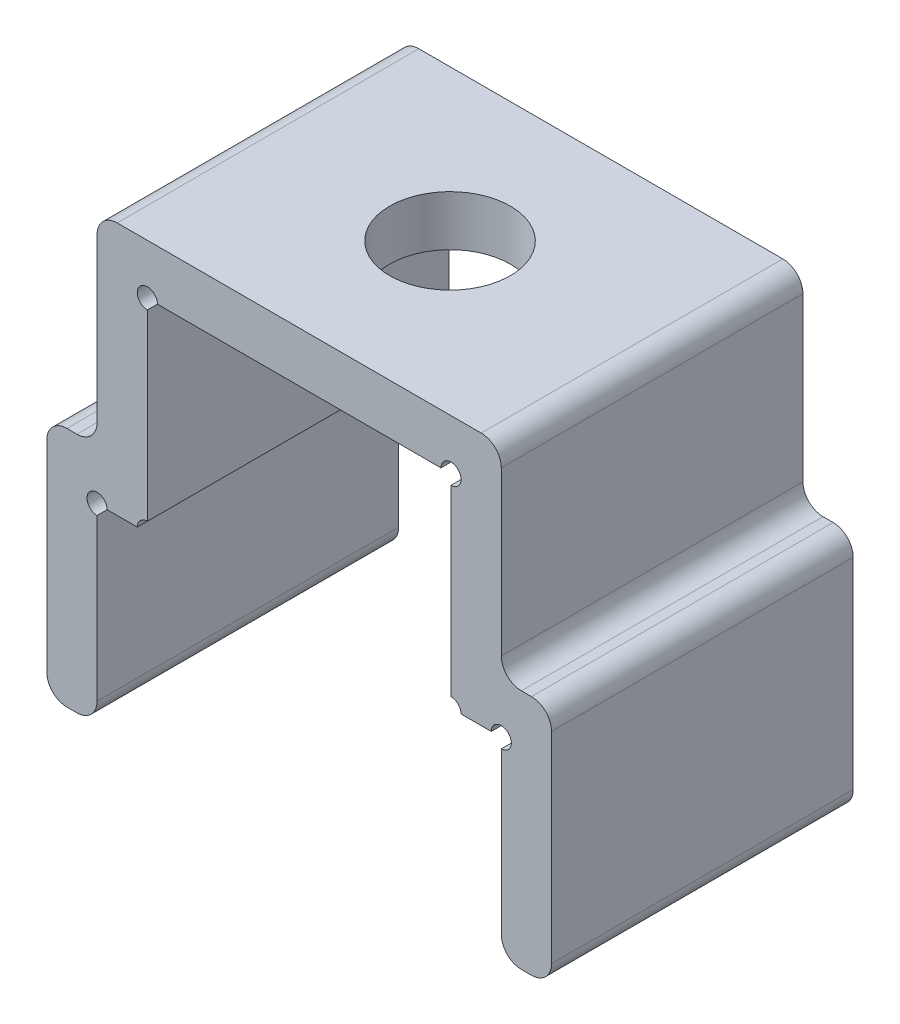
ISO-10303-21;
HEADER;
FILE_DESCRIPTION(('STEP AP214'),'2;1');
FILE_NAME('part.step','',(''),(''),'','','');
FILE_SCHEMA(('AUTOMOTIVE_DESIGN { 1 0 10303 214 1 1 1 1 }'));
ENDSEC;
DATA;
#1=APPLICATION_CONTEXT('core data for automotive mechanical design processes');
#2=APPLICATION_PROTOCOL_DEFINITION('international standard','automotive_design',2000,#1);
#3=PRODUCT_CONTEXT('',#1,'mechanical');
#4=PRODUCT('Part','Part','',(#3));
#5=PRODUCT_RELATED_PRODUCT_CATEGORY('part','',(#4));
#6=PRODUCT_DEFINITION_FORMATION('','',#4);
#7=PRODUCT_DEFINITION_CONTEXT('part definition',#1,'design');
#8=PRODUCT_DEFINITION('design','',#6,#7);
#9=PRODUCT_DEFINITION_SHAPE('','',#8);
#10=(LENGTH_UNIT() NAMED_UNIT(*) SI_UNIT(.MILLI.,.METRE.));
#11=(NAMED_UNIT(*) PLANE_ANGLE_UNIT() SI_UNIT($,.RADIAN.));
#12=(NAMED_UNIT(*) SI_UNIT($,.STERADIAN.) SOLID_ANGLE_UNIT());
#13=UNCERTAINTY_MEASURE_WITH_UNIT(LENGTH_MEASURE(1.E-05),#10,'distance_accuracy_value','');
#14=(GEOMETRIC_REPRESENTATION_CONTEXT(3) GLOBAL_UNCERTAINTY_ASSIGNED_CONTEXT((#13)) GLOBAL_UNIT_ASSIGNED_CONTEXT((#10,
#11,#12)) REPRESENTATION_CONTEXT('',''));
#15=CARTESIAN_POINT('',(0.,0.,0.));
#16=DIRECTION('',(0.,0.,1.));
#17=DIRECTION('',(1.,0.,0.));
#18=AXIS2_PLACEMENT_3D('',#15,#16,#17);
#19=CARTESIAN_POINT('',(7.55,5.05,15.));
#20=DIRECTION('',(0.,0.,-1.));
#21=DIRECTION('',(-1.,0.,0.));
#22=AXIS2_PLACEMENT_3D('',#19,#20,#21);
#23=CYLINDRICAL_SURFACE('',#22,0.5);
#24=CARTESIAN_POINT('',(7.55,5.05,0.));
#25=DIRECTION('',(0.,0.,-1.));
#26=DIRECTION('',(1.,0.,0.));
#27=AXIS2_PLACEMENT_3D('',#24,#25,#26);
#28=CIRCLE('',#27,0.5);
#29=CARTESIAN_POINT('',(7.05,5.05,0.));
#30=VERTEX_POINT('',#29);
#31=CARTESIAN_POINT('',(7.55,4.55,0.));
#32=VERTEX_POINT('',#31);
#33=EDGE_CURVE('E285',#30,#32,#28,.T.);
#34=ORIENTED_EDGE('',*,*,#33,.T.);
#35=DIRECTION('',(0.,0.,-1.));
#36=VECTOR('',#35,1.);
#37=CARTESIAN_POINT('',(7.55,4.55,15.));
#38=LINE('',#37,#36);
#39=CARTESIAN_POINT('',(7.55,4.55,15.));
#40=VERTEX_POINT('',#39);
#41=EDGE_CURVE('E11',#40,#32,#38,.T.);
#42=ORIENTED_EDGE('',*,*,#41,.F.);
#43=CARTESIAN_POINT('',(7.55,5.05,15.));
#44=DIRECTION('',(0.,0.,-1.));
#45=DIRECTION('',(1.,0.,0.));
#46=AXIS2_PLACEMENT_3D('',#43,#44,#45);
#47=CIRCLE('',#46,0.5);
#48=CARTESIAN_POINT('',(7.05,5.05,15.));
#49=VERTEX_POINT('',#48);
#50=EDGE_CURVE('E379',#49,#40,#47,.T.);
#51=ORIENTED_EDGE('',*,*,#50,.F.);
#52=DIRECTION('',(0.,0.,-1.));
#53=VECTOR('',#52,1.);
#54=CARTESIAN_POINT('',(7.05,5.05,15.));
#55=LINE('',#54,#53);
#56=EDGE_CURVE('E281',#49,#30,#55,.T.);
#57=ORIENTED_EDGE('',*,*,#56,.T.);
#58=EDGE_LOOP('',(#34,#42,#51,#57));
#59=FACE_BOUND('',#58,.T.);
#60=ADVANCED_FACE('F39',(#59),#23,.F.);
#61=CARTESIAN_POINT('',(7.55,4.55,15.));
#62=DIRECTION('',(1.,0.,0.));
#63=DIRECTION('',(0.,1.,0.));
#64=AXIS2_PLACEMENT_3D('',#61,#62,#63);
#65=PLANE('',#64);
#66=DIRECTION('',(0.,-1.,0.));
#67=VECTOR('',#66,1.);
#68=CARTESIAN_POINT('',(7.55,4.55,0.));
#69=LINE('',#68,#67);
#70=CARTESIAN_POINT('',(7.55,-4.55,0.));
#71=VERTEX_POINT('',#70);
#72=EDGE_CURVE('E289',#32,#71,#69,.T.);
#73=ORIENTED_EDGE('',*,*,#72,.T.);
#74=DIRECTION('',(0.,0.,-1.));
#75=VECTOR('',#74,1.);
#76=CARTESIAN_POINT('',(7.55,-4.55,15.));
#77=LINE('',#76,#75);
#78=CARTESIAN_POINT('',(7.55,-4.55,15.));
#79=VERTEX_POINT('',#78);
#80=EDGE_CURVE('E49',#79,#71,#77,.T.);
#81=ORIENTED_EDGE('',*,*,#80,.F.);
#82=DIRECTION('',(0.,-1.,0.));
#83=VECTOR('',#82,1.);
#84=CARTESIAN_POINT('',(7.55,4.55,15.));
#85=LINE('',#84,#83);
#86=EDGE_CURVE('E172',#40,#79,#85,.T.);
#87=ORIENTED_EDGE('',*,*,#86,.F.);
#88=ORIENTED_EDGE('',*,*,#41,.T.);
#89=EDGE_LOOP('',(#73,#81,#87,#88));
#90=FACE_BOUND('',#89,.T.);
#91=ADVANCED_FACE('F616',(#90),#65,.F.);
#92=CARTESIAN_POINT('',(7.55,-5.05,15.));
#93=DIRECTION('',(0.,0.,-1.));
#94=DIRECTION('',(-1.,0.,0.));
#95=AXIS2_PLACEMENT_3D('',#92,#93,#94);
#96=CYLINDRICAL_SURFACE('',#95,0.5);
#97=CARTESIAN_POINT('',(7.55,-5.05,0.));
#98=DIRECTION('',(0.,0.,-1.));
#99=DIRECTION('',(1.,0.,0.));
#100=AXIS2_PLACEMENT_3D('',#97,#98,#99);
#101=CIRCLE('',#100,0.5);
#102=CARTESIAN_POINT('',(8.05,-5.05,0.));
#103=VERTEX_POINT('',#102);
#104=EDGE_CURVE('E292',#71,#103,#101,.T.);
#105=ORIENTED_EDGE('',*,*,#104,.T.);
#106=DIRECTION('',(0.,0.,-1.));
#107=VECTOR('',#106,1.);
#108=CARTESIAN_POINT('',(8.05,-5.05,15.));
#109=LINE('',#108,#107);
#110=CARTESIAN_POINT('',(8.05,-5.05,15.));
#111=VERTEX_POINT('',#110);
#112=EDGE_CURVE('E486',#111,#103,#109,.T.);
#113=ORIENTED_EDGE('',*,*,#112,.F.);
#114=CARTESIAN_POINT('',(7.55,-5.05,15.));
#115=DIRECTION('',(0.,0.,-1.));
#116=DIRECTION('',(1.,0.,0.));
#117=AXIS2_PLACEMENT_3D('',#114,#115,#116);
#118=CIRCLE('',#117,0.5);
#119=EDGE_CURVE('E497',#79,#111,#118,.T.);
#120=ORIENTED_EDGE('',*,*,#119,.F.);
#121=ORIENTED_EDGE('',*,*,#80,.T.);
#122=EDGE_LOOP('',(#105,#113,#120,#121));
#123=FACE_BOUND('',#122,.T.);
#124=ADVANCED_FACE('F495',(#123),#96,.F.);
#125=CARTESIAN_POINT('',(8.05,-5.05,15.));
#126=DIRECTION('',(0.,1.,0.));
#127=DIRECTION('',(0.,0.,1.));
#128=AXIS2_PLACEMENT_3D('',#125,#126,#127);
#129=PLANE('',#128);
#130=DIRECTION('',(1.,0.,0.));
#131=VECTOR('',#130,1.);
#132=CARTESIAN_POINT('',(8.05,-5.05,0.));
#133=LINE('',#132,#131);
#134=CARTESIAN_POINT('',(9.55,-5.05,0.));
#135=VERTEX_POINT('',#134);
#136=EDGE_CURVE('E295',#103,#135,#133,.T.);
#137=ORIENTED_EDGE('',*,*,#136,.T.);
#138=DIRECTION('',(0.,0.,-1.));
#139=VECTOR('',#138,1.);
#140=CARTESIAN_POINT('',(9.55,-5.05,15.));
#141=LINE('',#140,#139);
#142=CARTESIAN_POINT('',(9.55,-5.05,15.));
#143=VERTEX_POINT('',#142);
#144=EDGE_CURVE('E482',#143,#135,#141,.T.);
#145=ORIENTED_EDGE('',*,*,#144,.F.);
#146=DIRECTION('',(1.,0.,0.));
#147=VECTOR('',#146,1.);
#148=CARTESIAN_POINT('',(8.05,-5.05,15.));
#149=LINE('',#148,#147);
#150=EDGE_CURVE('E516',#111,#143,#149,.T.);
#151=ORIENTED_EDGE('',*,*,#150,.F.);
#152=ORIENTED_EDGE('',*,*,#112,.T.);
#153=EDGE_LOOP('',(#137,#145,#151,#152));
#154=FACE_BOUND('',#153,.T.);
#155=ADVANCED_FACE('F506',(#154),#129,.F.);
#156=CARTESIAN_POINT('',(10.05,-5.05,15.));
#157=DIRECTION('',(0.,0.,-1.));
#158=DIRECTION('',(-1.,0.,0.));
#159=AXIS2_PLACEMENT_3D('',#156,#157,#158);
#160=CYLINDRICAL_SURFACE('',#159,0.5);
#161=CARTESIAN_POINT('',(10.05,-5.05,0.));
#162=DIRECTION('',(0.,0.,-1.));
#163=DIRECTION('',(1.,0.,0.));
#164=AXIS2_PLACEMENT_3D('',#161,#162,#163);
#165=CIRCLE('',#164,0.5);
#166=CARTESIAN_POINT('',(10.05,-5.55,0.));
#167=VERTEX_POINT('',#166);
#168=EDGE_CURVE('E298',#135,#167,#165,.T.);
#169=ORIENTED_EDGE('',*,*,#168,.T.);
#170=DIRECTION('',(0.,0.,-1.));
#171=VECTOR('',#170,1.);
#172=CARTESIAN_POINT('',(10.05,-5.55,15.));
#173=LINE('',#172,#171);
#174=CARTESIAN_POINT('',(10.05,-5.55,15.));
#175=VERTEX_POINT('',#174);
#176=EDGE_CURVE('E478',#175,#167,#173,.T.);
#177=ORIENTED_EDGE('',*,*,#176,.F.);
#178=CARTESIAN_POINT('',(10.05,-5.05,15.));
#179=DIRECTION('',(0.,0.,-1.));
#180=DIRECTION('',(1.,0.,0.));
#181=AXIS2_PLACEMENT_3D('',#178,#179,#180);
#182=CIRCLE('',#181,0.5);
#183=EDGE_CURVE('E512',#143,#175,#182,.T.);
#184=ORIENTED_EDGE('',*,*,#183,.F.);
#185=ORIENTED_EDGE('',*,*,#144,.T.);
#186=EDGE_LOOP('',(#169,#177,#184,#185));
#187=FACE_BOUND('',#186,.T.);
#188=ADVANCED_FACE('F510',(#187),#160,.F.);
#189=CARTESIAN_POINT('',(10.05,-5.55,15.));
#190=DIRECTION('',(1.,0.,0.));
#191=DIRECTION('',(0.,1.,0.));
#192=AXIS2_PLACEMENT_3D('',#189,#190,#191);
#193=PLANE('',#192);
#194=DIRECTION('',(0.,-1.,0.));
#195=VECTOR('',#194,1.);
#196=CARTESIAN_POINT('',(10.05,-5.55,0.));
#197=LINE('',#196,#195);
#198=CARTESIAN_POINT('',(10.05,-13.55,0.));
#199=VERTEX_POINT('',#198);
#200=EDGE_CURVE('E301',#167,#199,#197,.T.);
#201=ORIENTED_EDGE('',*,*,#200,.T.);
#202=DIRECTION('',(0.,0.,-1.));
#203=VECTOR('',#202,1.);
#204=CARTESIAN_POINT('',(10.05,-13.55,15.));
#205=LINE('',#204,#203);
#206=CARTESIAN_POINT('',(10.05,-13.55,15.));
#207=VERTEX_POINT('',#206);
#208=EDGE_CURVE('E474',#207,#199,#205,.T.);
#209=ORIENTED_EDGE('',*,*,#208,.F.);
#210=DIRECTION('',(0.,-1.,0.));
#211=VECTOR('',#210,1.);
#212=CARTESIAN_POINT('',(10.05,-5.55,15.));
#213=LINE('',#212,#211);
#214=EDGE_CURVE('E515',#175,#207,#213,.T.);
#215=ORIENTED_EDGE('',*,*,#214,.F.);
#216=ORIENTED_EDGE('',*,*,#176,.T.);
#217=EDGE_LOOP('',(#201,#209,#215,#216));
#218=FACE_BOUND('',#217,.T.);
#219=ADVANCED_FACE('F629',(#218),#193,.F.);
#220=CARTESIAN_POINT('',(11.05,-13.55,15.));
#221=DIRECTION('',(0.,0.,-1.));
#222=DIRECTION('',(-1.,0.,0.));
#223=AXIS2_PLACEMENT_3D('',#220,#221,#222);
#224=CYLINDRICAL_SURFACE('',#223,1.);
#225=CARTESIAN_POINT('',(11.05,-13.55,0.));
#226=DIRECTION('',(0.,0.,1.));
#227=DIRECTION('',(-1.,0.,0.));
#228=AXIS2_PLACEMENT_3D('',#225,#226,#227);
#229=CIRCLE('',#228,1.);
#230=CARTESIAN_POINT('',(11.05,-14.55,0.));
#231=VERTEX_POINT('',#230);
#232=EDGE_CURVE('E304',#199,#231,#229,.T.);
#233=ORIENTED_EDGE('',*,*,#232,.T.);
#234=DIRECTION('',(0.,0.,-1.));
#235=VECTOR('',#234,1.);
#236=CARTESIAN_POINT('',(11.05,-14.55,15.));
#237=LINE('',#236,#235);
#238=CARTESIAN_POINT('',(11.05,-14.55,15.));
#239=VERTEX_POINT('',#238);
#240=EDGE_CURVE('E470',#239,#231,#237,.T.);
#241=ORIENTED_EDGE('',*,*,#240,.F.);
#242=CARTESIAN_POINT('',(11.05,-13.55,15.));
#243=DIRECTION('',(0.,0.,1.));
#244=DIRECTION('',(-1.,0.,0.));
#245=AXIS2_PLACEMENT_3D('',#242,#243,#244);
#246=CIRCLE('',#245,1.);
#247=EDGE_CURVE('E520',#207,#239,#246,.T.);
#248=ORIENTED_EDGE('',*,*,#247,.F.);
#249=ORIENTED_EDGE('',*,*,#208,.T.);
#250=EDGE_LOOP('',(#233,#241,#248,#249));
#251=FACE_BOUND('',#250,.T.);
#252=ADVANCED_FACE('F632',(#251),#224,.T.);
#253=CARTESIAN_POINT('',(11.05,-14.55,15.));
#254=DIRECTION('',(0.,1.,0.));
#255=DIRECTION('',(0.,0.,1.));
#256=AXIS2_PLACEMENT_3D('',#253,#254,#255);
#257=PLANE('',#256);
#258=DIRECTION('',(1.,0.,0.));
#259=VECTOR('',#258,1.);
#260=CARTESIAN_POINT('',(11.05,-14.55,0.));
#261=LINE('',#260,#259);
#262=CARTESIAN_POINT('',(11.55,-14.55,0.));
#263=VERTEX_POINT('',#262);
#264=EDGE_CURVE('E307',#231,#263,#261,.T.);
#265=ORIENTED_EDGE('',*,*,#264,.T.);
#266=DIRECTION('',(0.,0.,-1.));
#267=VECTOR('',#266,1.);
#268=CARTESIAN_POINT('',(11.55,-14.55,15.));
#269=LINE('',#268,#267);
#270=CARTESIAN_POINT('',(11.55,-14.55,15.));
#271=VERTEX_POINT('',#270);
#272=EDGE_CURVE('E466',#271,#263,#269,.T.);
#273=ORIENTED_EDGE('',*,*,#272,.F.);
#274=DIRECTION('',(1.,0.,0.));
#275=VECTOR('',#274,1.);
#276=CARTESIAN_POINT('',(11.05,-14.55,15.));
#277=LINE('',#276,#275);
#278=EDGE_CURVE('E527',#239,#271,#277,.T.);
#279=ORIENTED_EDGE('',*,*,#278,.F.);
#280=ORIENTED_EDGE('',*,*,#240,.T.);
#281=EDGE_LOOP('',(#265,#273,#279,#280));
#282=FACE_BOUND('',#281,.T.);
#283=ADVANCED_FACE('F636',(#282),#257,.F.);
#284=CARTESIAN_POINT('',(11.55,-13.55,15.));
#285=DIRECTION('',(0.,0.,-1.));
#286=DIRECTION('',(-1.,0.,0.));
#287=AXIS2_PLACEMENT_3D('',#284,#285,#286);
#288=CYLINDRICAL_SURFACE('',#287,1.);
#289=CARTESIAN_POINT('',(11.55,-13.55,0.));
#290=DIRECTION('',(0.,0.,1.));
#291=DIRECTION('',(1.,0.,0.));
#292=AXIS2_PLACEMENT_3D('',#289,#290,#291);
#293=CIRCLE('',#292,1.);
#294=CARTESIAN_POINT('',(12.55,-13.55,0.));
#295=VERTEX_POINT('',#294);
#296=EDGE_CURVE('E310',#263,#295,#293,.T.);
#297=ORIENTED_EDGE('',*,*,#296,.T.);
#298=DIRECTION('',(0.,0.,-1.));
#299=VECTOR('',#298,1.);
#300=CARTESIAN_POINT('',(12.55,-13.55,15.));
#301=LINE('',#300,#299);
#302=CARTESIAN_POINT('',(12.55,-13.55,15.));
#303=VERTEX_POINT('',#302);
#304=EDGE_CURVE('E462',#303,#295,#301,.T.);
#305=ORIENTED_EDGE('',*,*,#304,.F.);
#306=CARTESIAN_POINT('',(11.55,-13.55,15.));
#307=DIRECTION('',(0.,0.,1.));
#308=DIRECTION('',(1.,0.,0.));
#309=AXIS2_PLACEMENT_3D('',#306,#307,#308);
#310=CIRCLE('',#309,1.);
#311=EDGE_CURVE('E530',#271,#303,#310,.T.);
#312=ORIENTED_EDGE('',*,*,#311,.F.);
#313=ORIENTED_EDGE('',*,*,#272,.T.);
#314=EDGE_LOOP('',(#297,#305,#312,#313));
#315=FACE_BOUND('',#314,.T.);
#316=ADVANCED_FACE('F640',(#315),#288,.T.);
#317=CARTESIAN_POINT('',(12.55,-3.55000000000001,15.));
#318=DIRECTION('',(-1.,0.,0.));
#319=DIRECTION('',(0.,-1.,0.));
#320=AXIS2_PLACEMENT_3D('',#317,#318,#319);
#321=PLANE('',#320);
#322=DIRECTION('',(0.,1.,0.));
#323=VECTOR('',#322,1.);
#324=CARTESIAN_POINT('',(12.55,-3.55000000000001,0.));
#325=LINE('',#324,#323);
#326=CARTESIAN_POINT('',(12.55,-3.55000000000001,0.));
#327=VERTEX_POINT('',#326);
#328=EDGE_CURVE('E313',#295,#327,#325,.T.);
#329=ORIENTED_EDGE('',*,*,#328,.T.);
#330=DIRECTION('',(0.,0.,-1.));
#331=VECTOR('',#330,1.);
#332=CARTESIAN_POINT('',(12.55,-3.55000000000001,15.));
#333=LINE('',#332,#331);
#334=CARTESIAN_POINT('',(12.55,-3.55000000000001,15.));
#335=VERTEX_POINT('',#334);
#336=EDGE_CURVE('E458',#335,#327,#333,.T.);
#337=ORIENTED_EDGE('',*,*,#336,.F.);
#338=DIRECTION('',(0.,1.,0.));
#339=VECTOR('',#338,1.);
#340=CARTESIAN_POINT('',(12.55,-3.55000000000001,15.));
#341=LINE('',#340,#339);
#342=EDGE_CURVE('E533',#303,#335,#341,.T.);
#343=ORIENTED_EDGE('',*,*,#342,.F.);
#344=ORIENTED_EDGE('',*,*,#304,.T.);
#345=EDGE_LOOP('',(#329,#337,#343,#344));
#346=FACE_BOUND('',#345,.T.);
#347=ADVANCED_FACE('F644',(#346),#321,.F.);
#348=CARTESIAN_POINT('',(11.55,-3.55,15.));
#349=DIRECTION('',(0.,0.,-1.));
#350=DIRECTION('',(-1.,0.,0.));
#351=AXIS2_PLACEMENT_3D('',#348,#349,#350);
#352=CYLINDRICAL_SURFACE('',#351,1.);
#353=CARTESIAN_POINT('',(11.55,-3.55,0.));
#354=DIRECTION('',(0.,0.,1.));
#355=DIRECTION('',(-1.,0.,0.));
#356=AXIS2_PLACEMENT_3D('',#353,#354,#355);
#357=CIRCLE('',#356,1.);
#358=CARTESIAN_POINT('',(11.55,-2.55,0.));
#359=VERTEX_POINT('',#358);
#360=EDGE_CURVE('E316',#327,#359,#357,.T.);
#361=ORIENTED_EDGE('',*,*,#360,.T.);
#362=DIRECTION('',(0.,0.,-1.));
#363=VECTOR('',#362,1.);
#364=CARTESIAN_POINT('',(11.55,-2.55,15.));
#365=LINE('',#364,#363);
#366=CARTESIAN_POINT('',(11.55,-2.55,15.));
#367=VERTEX_POINT('',#366);
#368=EDGE_CURVE('E454',#367,#359,#365,.T.);
#369=ORIENTED_EDGE('',*,*,#368,.F.);
#370=CARTESIAN_POINT('',(11.55,-3.55,15.));
#371=DIRECTION('',(0.,0.,1.));
#372=DIRECTION('',(-1.,0.,0.));
#373=AXIS2_PLACEMENT_3D('',#370,#371,#372);
#374=CIRCLE('',#373,1.);
#375=EDGE_CURVE('E536',#335,#367,#374,.T.);
#376=ORIENTED_EDGE('',*,*,#375,.F.);
#377=ORIENTED_EDGE('',*,*,#336,.T.);
#378=EDGE_LOOP('',(#361,#369,#376,#377));
#379=FACE_BOUND('',#378,.T.);
#380=ADVANCED_FACE('F648',(#379),#352,.T.);
#381=CARTESIAN_POINT('',(11.05,-2.55,15.));
#382=DIRECTION('',(0.,-1.,0.));
#383=DIRECTION('',(0.,0.,-1.));
#384=AXIS2_PLACEMENT_3D('',#381,#382,#383);
#385=PLANE('',#384);
#386=DIRECTION('',(-1.,0.,0.));
#387=VECTOR('',#386,1.);
#388=CARTESIAN_POINT('',(11.05,-2.55,0.));
#389=LINE('',#388,#387);
#390=CARTESIAN_POINT('',(11.05,-2.55,0.));
#391=VERTEX_POINT('',#390);
#392=EDGE_CURVE('E319',#359,#391,#389,.T.);
#393=ORIENTED_EDGE('',*,*,#392,.T.);
#394=DIRECTION('',(0.,0.,-1.));
#395=VECTOR('',#394,1.);
#396=CARTESIAN_POINT('',(11.05,-2.55,15.));
#397=LINE('',#396,#395);
#398=CARTESIAN_POINT('',(11.05,-2.55,15.));
#399=VERTEX_POINT('',#398);
#400=EDGE_CURVE('E450',#399,#391,#397,.T.);
#401=ORIENTED_EDGE('',*,*,#400,.F.);
#402=DIRECTION('',(-1.,0.,0.));
#403=VECTOR('',#402,1.);
#404=CARTESIAN_POINT('',(11.05,-2.55,15.));
#405=LINE('',#404,#403);
#406=EDGE_CURVE('E539',#367,#399,#405,.T.);
#407=ORIENTED_EDGE('',*,*,#406,.F.);
#408=ORIENTED_EDGE('',*,*,#368,.T.);
#409=EDGE_LOOP('',(#393,#401,#407,#408));
#410=FACE_BOUND('',#409,.T.);
#411=ADVANCED_FACE('F652',(#410),#385,.F.);
#412=CARTESIAN_POINT('',(11.05,-1.55,15.));
#413=DIRECTION('',(0.,0.,-1.));
#414=DIRECTION('',(-1.,0.,0.));
#415=AXIS2_PLACEMENT_3D('',#412,#413,#414);
#416=CYLINDRICAL_SURFACE('',#415,1.);
#417=CARTESIAN_POINT('',(11.05,-1.55,0.));
#418=DIRECTION('',(0.,0.,-1.));
#419=DIRECTION('',(1.,0.,0.));
#420=AXIS2_PLACEMENT_3D('',#417,#418,#419);
#421=CIRCLE('',#420,1.);
#422=CARTESIAN_POINT('',(10.05,-1.55,0.));
#423=VERTEX_POINT('',#422);
#424=EDGE_CURVE('E322',#391,#423,#421,.T.);
#425=ORIENTED_EDGE('',*,*,#424,.T.);
#426=DIRECTION('',(0.,0.,-1.));
#427=VECTOR('',#426,1.);
#428=CARTESIAN_POINT('',(10.05,-1.55,15.));
#429=LINE('',#428,#427);
#430=CARTESIAN_POINT('',(10.05,-1.55,15.));
#431=VERTEX_POINT('',#430);
#432=EDGE_CURVE('E446',#431,#423,#429,.T.);
#433=ORIENTED_EDGE('',*,*,#432,.F.);
#434=CARTESIAN_POINT('',(11.05,-1.55,15.));
#435=DIRECTION('',(0.,0.,-1.));
#436=DIRECTION('',(1.,0.,0.));
#437=AXIS2_PLACEMENT_3D('',#434,#435,#436);
#438=CIRCLE('',#437,1.);
#439=EDGE_CURVE('E542',#399,#431,#438,.T.);
#440=ORIENTED_EDGE('',*,*,#439,.F.);
#441=ORIENTED_EDGE('',*,*,#400,.T.);
#442=EDGE_LOOP('',(#425,#433,#440,#441));
#443=FACE_BOUND('',#442,.T.);
#444=ADVANCED_FACE('F656',(#443),#416,.F.);
#445=CARTESIAN_POINT('',(10.05,6.54999999999999,15.));
#446=DIRECTION('',(-1.,0.,0.));
#447=DIRECTION('',(0.,-1.,0.));
#448=AXIS2_PLACEMENT_3D('',#445,#446,#447);
#449=PLANE('',#448);
#450=DIRECTION('',(0.,1.,0.));
#451=VECTOR('',#450,1.);
#452=CARTESIAN_POINT('',(10.05,6.54999999999999,0.));
#453=LINE('',#452,#451);
#454=CARTESIAN_POINT('',(10.05,6.54999999999999,0.));
#455=VERTEX_POINT('',#454);
#456=EDGE_CURVE('E325',#423,#455,#453,.T.);
#457=ORIENTED_EDGE('',*,*,#456,.T.);
#458=DIRECTION('',(0.,0.,-1.));
#459=VECTOR('',#458,1.);
#460=CARTESIAN_POINT('',(10.05,6.54999999999999,15.));
#461=LINE('',#460,#459);
#462=CARTESIAN_POINT('',(10.05,6.54999999999999,15.));
#463=VERTEX_POINT('',#462);
#464=EDGE_CURVE('E442',#463,#455,#461,.T.);
#465=ORIENTED_EDGE('',*,*,#464,.F.);
#466=DIRECTION('',(0.,1.,0.));
#467=VECTOR('',#466,1.);
#468=CARTESIAN_POINT('',(10.05,6.54999999999999,15.));
#469=LINE('',#468,#467);
#470=EDGE_CURVE('E545',#431,#463,#469,.T.);
#471=ORIENTED_EDGE('',*,*,#470,.F.);
#472=ORIENTED_EDGE('',*,*,#432,.T.);
#473=EDGE_LOOP('',(#457,#465,#471,#472));
#474=FACE_BOUND('',#473,.T.);
#475=ADVANCED_FACE('F660',(#474),#449,.F.);
#476=CARTESIAN_POINT('',(9.05,6.55,15.));
#477=DIRECTION('',(0.,0.,-1.));
#478=DIRECTION('',(-1.,0.,0.));
#479=AXIS2_PLACEMENT_3D('',#476,#477,#478);
#480=CYLINDRICAL_SURFACE('',#479,1.);
#481=CARTESIAN_POINT('',(9.05,6.55,0.));
#482=DIRECTION('',(0.,0.,1.));
#483=DIRECTION('',(1.,0.,0.));
#484=AXIS2_PLACEMENT_3D('',#481,#482,#483);
#485=CIRCLE('',#484,1.);
#486=CARTESIAN_POINT('',(9.04999999999999,7.55,0.));
#487=VERTEX_POINT('',#486);
#488=EDGE_CURVE('E328',#455,#487,#485,.T.);
#489=ORIENTED_EDGE('',*,*,#488,.T.);
#490=DIRECTION('',(0.,0.,-1.));
#491=VECTOR('',#490,1.);
#492=CARTESIAN_POINT('',(9.04999999999999,7.55,15.));
#493=LINE('',#492,#491);
#494=CARTESIAN_POINT('',(9.04999999999999,7.55,15.));
#495=VERTEX_POINT('',#494);
#496=EDGE_CURVE('E438',#495,#487,#493,.T.);
#497=ORIENTED_EDGE('',*,*,#496,.F.);
#498=CARTESIAN_POINT('',(9.05,6.55,15.));
#499=DIRECTION('',(0.,0.,1.));
#500=DIRECTION('',(1.,0.,0.));
#501=AXIS2_PLACEMENT_3D('',#498,#499,#500);
#502=CIRCLE('',#501,1.);
#503=EDGE_CURVE('E548',#463,#495,#502,.T.);
#504=ORIENTED_EDGE('',*,*,#503,.F.);
#505=ORIENTED_EDGE('',*,*,#464,.T.);
#506=EDGE_LOOP('',(#489,#497,#504,#505));
#507=FACE_BOUND('',#506,.T.);
#508=ADVANCED_FACE('F664',(#507),#480,.T.);
#509=CARTESIAN_POINT('',(9.04999999999999,7.55,15.));
#510=DIRECTION('',(0.,-1.,0.));
#511=DIRECTION('',(1.,0.,0.));
#512=AXIS2_PLACEMENT_3D('',#509,#510,#511);
#513=PLANE('',#512);
#514=CARTESIAN_POINT('',(0.,7.55,7.5));
#515=DIRECTION('',(0.,1.,0.));
#516=DIRECTION('',(-1.,0.,0.));
#517=AXIS2_PLACEMENT_3D('',#514,#515,#516);
#518=CIRCLE('',#517,3.);
#519=CARTESIAN_POINT('',(-3.,7.55,7.5));
#520=VERTEX_POINT('',#519);
#521=EDGE_CURVE('E772',#520,#520,#518,.T.);
#522=ORIENTED_EDGE('',*,*,#521,.F.);
#523=EDGE_LOOP('',(#522));
#524=FACE_BOUND('',#523,.T.);
#525=DIRECTION('',(-1.,0.,0.));
#526=VECTOR('',#525,1.);
#527=CARTESIAN_POINT('',(9.04999999999999,7.55,0.));
#528=LINE('',#527,#526);
#529=CARTESIAN_POINT('',(-9.04999999999999,7.55,0.));
#530=VERTEX_POINT('',#529);
#531=EDGE_CURVE('E331',#487,#530,#528,.T.);
#532=ORIENTED_EDGE('',*,*,#531,.T.);
#533=DIRECTION('',(0.,0.,-1.));
#534=VECTOR('',#533,1.);
#535=CARTESIAN_POINT('',(-9.04999999999999,7.55,15.));
#536=LINE('',#535,#534);
#537=CARTESIAN_POINT('',(-9.04999999999999,7.55,15.));
#538=VERTEX_POINT('',#537);
#539=EDGE_CURVE('E434',#538,#530,#536,.T.);
#540=ORIENTED_EDGE('',*,*,#539,.F.);
#541=DIRECTION('',(-1.,0.,0.));
#542=VECTOR('',#541,1.);
#543=CARTESIAN_POINT('',(9.04999999999999,7.55,15.));
#544=LINE('',#543,#542);
#545=EDGE_CURVE('E551',#495,#538,#544,.T.);
#546=ORIENTED_EDGE('',*,*,#545,.F.);
#547=ORIENTED_EDGE('',*,*,#496,.T.);
#548=EDGE_LOOP('',(#532,#540,#546,#547));
#549=FACE_BOUND('',#548,.T.);
#550=ADVANCED_FACE('F668',(#524,#549),#513,.F.);
#551=CARTESIAN_POINT('',(-9.05,6.55,15.));
#552=DIRECTION('',(0.,0.,-1.));
#553=DIRECTION('',(-1.,0.,0.));
#554=AXIS2_PLACEMENT_3D('',#551,#552,#553);
#555=CYLINDRICAL_SURFACE('',#554,1.);
#556=CARTESIAN_POINT('',(-9.05,6.55,0.));
#557=DIRECTION('',(0.,0.,1.));
#558=DIRECTION('',(-1.,0.,0.));
#559=AXIS2_PLACEMENT_3D('',#556,#557,#558);
#560=CIRCLE('',#559,1.);
#561=CARTESIAN_POINT('',(-10.05,6.54999999999999,0.));
#562=VERTEX_POINT('',#561);
#563=EDGE_CURVE('E334',#530,#562,#560,.T.);
#564=ORIENTED_EDGE('',*,*,#563,.T.);
#565=DIRECTION('',(0.,0.,-1.));
#566=VECTOR('',#565,1.);
#567=CARTESIAN_POINT('',(-10.05,6.54999999999999,15.));
#568=LINE('',#567,#566);
#569=CARTESIAN_POINT('',(-10.05,6.54999999999999,15.));
#570=VERTEX_POINT('',#569);
#571=EDGE_CURVE('E430',#570,#562,#568,.T.);
#572=ORIENTED_EDGE('',*,*,#571,.F.);
#573=CARTESIAN_POINT('',(-9.05,6.55,15.));
#574=DIRECTION('',(0.,0.,1.));
#575=DIRECTION('',(-1.,0.,0.));
#576=AXIS2_PLACEMENT_3D('',#573,#574,#575);
#577=CIRCLE('',#576,1.);
#578=EDGE_CURVE('E554',#538,#570,#577,.T.);
#579=ORIENTED_EDGE('',*,*,#578,.F.);
#580=ORIENTED_EDGE('',*,*,#539,.T.);
#581=EDGE_LOOP('',(#564,#572,#579,#580));
#582=FACE_BOUND('',#581,.T.);
#583=ADVANCED_FACE('F672',(#582),#555,.T.);
#584=CARTESIAN_POINT('',(-10.05,6.54999999999999,15.));
#585=DIRECTION('',(1.,0.,0.));
#586=DIRECTION('',(0.,1.,0.));
#587=AXIS2_PLACEMENT_3D('',#584,#585,#586);
#588=PLANE('',#587);
#589=DIRECTION('',(0.,-1.,0.));
#590=VECTOR('',#589,1.);
#591=CARTESIAN_POINT('',(-10.05,6.54999999999999,0.));
#592=LINE('',#591,#590);
#593=CARTESIAN_POINT('',(-10.05,-1.55,0.));
#594=VERTEX_POINT('',#593);
#595=EDGE_CURVE('E337',#562,#594,#592,.T.);
#596=ORIENTED_EDGE('',*,*,#595,.T.);
#597=DIRECTION('',(0.,0.,-1.));
#598=VECTOR('',#597,1.);
#599=CARTESIAN_POINT('',(-10.05,-1.55,15.));
#600=LINE('',#599,#598);
#601=CARTESIAN_POINT('',(-10.05,-1.55,15.));
#602=VERTEX_POINT('',#601);
#603=EDGE_CURVE('E426',#602,#594,#600,.T.);
#604=ORIENTED_EDGE('',*,*,#603,.F.);
#605=DIRECTION('',(0.,-1.,0.));
#606=VECTOR('',#605,1.);
#607=CARTESIAN_POINT('',(-10.05,6.54999999999999,15.));
#608=LINE('',#607,#606);
#609=EDGE_CURVE('E557',#570,#602,#608,.T.);
#610=ORIENTED_EDGE('',*,*,#609,.F.);
#611=ORIENTED_EDGE('',*,*,#571,.T.);
#612=EDGE_LOOP('',(#596,#604,#610,#611));
#613=FACE_BOUND('',#612,.T.);
#614=ADVANCED_FACE('F676',(#613),#588,.F.);
#615=CARTESIAN_POINT('',(-11.05,-1.55,15.));
#616=DIRECTION('',(0.,0.,-1.));
#617=DIRECTION('',(-1.,0.,0.));
#618=AXIS2_PLACEMENT_3D('',#615,#616,#617);
#619=CYLINDRICAL_SURFACE('',#618,1.);
#620=CARTESIAN_POINT('',(-11.05,-1.55,0.));
#621=DIRECTION('',(0.,0.,-1.));
#622=DIRECTION('',(1.,0.,0.));
#623=AXIS2_PLACEMENT_3D('',#620,#621,#622);
#624=CIRCLE('',#623,1.);
#625=CARTESIAN_POINT('',(-11.05,-2.55,0.));
#626=VERTEX_POINT('',#625);
#627=EDGE_CURVE('E340',#594,#626,#624,.T.);
#628=ORIENTED_EDGE('',*,*,#627,.T.);
#629=DIRECTION('',(0.,0.,-1.));
#630=VECTOR('',#629,1.);
#631=CARTESIAN_POINT('',(-11.05,-2.55,15.));
#632=LINE('',#631,#630);
#633=CARTESIAN_POINT('',(-11.05,-2.55,15.));
#634=VERTEX_POINT('',#633);
#635=EDGE_CURVE('E422',#634,#626,#632,.T.);
#636=ORIENTED_EDGE('',*,*,#635,.F.);
#637=CARTESIAN_POINT('',(-11.05,-1.55,15.));
#638=DIRECTION('',(0.,0.,-1.));
#639=DIRECTION('',(1.,0.,0.));
#640=AXIS2_PLACEMENT_3D('',#637,#638,#639);
#641=CIRCLE('',#640,1.);
#642=EDGE_CURVE('E560',#602,#634,#641,.T.);
#643=ORIENTED_EDGE('',*,*,#642,.F.);
#644=ORIENTED_EDGE('',*,*,#603,.T.);
#645=EDGE_LOOP('',(#628,#636,#643,#644));
#646=FACE_BOUND('',#645,.T.);
#647=ADVANCED_FACE('F680',(#646),#619,.F.);
#648=CARTESIAN_POINT('',(-11.55,-2.55,15.));
#649=DIRECTION('',(0.,-1.,0.));
#650=DIRECTION('',(0.,0.,-1.));
#651=AXIS2_PLACEMENT_3D('',#648,#649,#650);
#652=PLANE('',#651);
#653=DIRECTION('',(-1.,0.,0.));
#654=VECTOR('',#653,1.);
#655=CARTESIAN_POINT('',(-11.55,-2.55,0.));
#656=LINE('',#655,#654);
#657=CARTESIAN_POINT('',(-11.55,-2.55,0.));
#658=VERTEX_POINT('',#657);
#659=EDGE_CURVE('E343',#626,#658,#656,.T.);
#660=ORIENTED_EDGE('',*,*,#659,.T.);
#661=DIRECTION('',(0.,0.,-1.));
#662=VECTOR('',#661,1.);
#663=CARTESIAN_POINT('',(-11.55,-2.55,15.));
#664=LINE('',#663,#662);
#665=CARTESIAN_POINT('',(-11.55,-2.55,15.));
#666=VERTEX_POINT('',#665);
#667=EDGE_CURVE('E418',#666,#658,#664,.T.);
#668=ORIENTED_EDGE('',*,*,#667,.F.);
#669=DIRECTION('',(-1.,0.,0.));
#670=VECTOR('',#669,1.);
#671=CARTESIAN_POINT('',(-11.55,-2.55,15.));
#672=LINE('',#671,#670);
#673=EDGE_CURVE('E563',#634,#666,#672,.T.);
#674=ORIENTED_EDGE('',*,*,#673,.F.);
#675=ORIENTED_EDGE('',*,*,#635,.T.);
#676=EDGE_LOOP('',(#660,#668,#674,#675));
#677=FACE_BOUND('',#676,.T.);
#678=ADVANCED_FACE('F684',(#677),#652,.F.);
#679=CARTESIAN_POINT('',(-11.55,-3.55,15.));
#680=DIRECTION('',(0.,0.,-1.));
#681=DIRECTION('',(-1.,0.,0.));
#682=AXIS2_PLACEMENT_3D('',#679,#680,#681);
#683=CYLINDRICAL_SURFACE('',#682,1.);
#684=CARTESIAN_POINT('',(-11.55,-3.55,0.));
#685=DIRECTION('',(0.,0.,1.));
#686=DIRECTION('',(1.,0.,0.));
#687=AXIS2_PLACEMENT_3D('',#684,#685,#686);
#688=CIRCLE('',#687,1.);
#689=CARTESIAN_POINT('',(-12.55,-3.55000000000001,0.));
#690=VERTEX_POINT('',#689);
#691=EDGE_CURVE('E346',#658,#690,#688,.T.);
#692=ORIENTED_EDGE('',*,*,#691,.T.);
#693=DIRECTION('',(0.,0.,-1.));
#694=VECTOR('',#693,1.);
#695=CARTESIAN_POINT('',(-12.55,-3.55000000000001,15.));
#696=LINE('',#695,#694);
#697=CARTESIAN_POINT('',(-12.55,-3.55000000000001,15.));
#698=VERTEX_POINT('',#697);
#699=EDGE_CURVE('E414',#698,#690,#696,.T.);
#700=ORIENTED_EDGE('',*,*,#699,.F.);
#701=CARTESIAN_POINT('',(-11.55,-3.55,15.));
#702=DIRECTION('',(0.,0.,1.));
#703=DIRECTION('',(1.,0.,0.));
#704=AXIS2_PLACEMENT_3D('',#701,#702,#703);
#705=CIRCLE('',#704,1.);
#706=EDGE_CURVE('E566',#666,#698,#705,.T.);
#707=ORIENTED_EDGE('',*,*,#706,.F.);
#708=ORIENTED_EDGE('',*,*,#667,.T.);
#709=EDGE_LOOP('',(#692,#700,#707,#708));
#710=FACE_BOUND('',#709,.T.);
#711=ADVANCED_FACE('F688',(#710),#683,.T.);
#712=CARTESIAN_POINT('',(-12.55,-13.55,15.));
#713=DIRECTION('',(1.,0.,0.));
#714=DIRECTION('',(0.,0.,-1.));
#715=AXIS2_PLACEMENT_3D('',#712,#713,#714);
#716=PLANE('',#715);
#717=DIRECTION('',(0.,-1.,0.));
#718=VECTOR('',#717,1.);
#719=CARTESIAN_POINT('',(-12.55,-13.55,0.));
#720=LINE('',#719,#718);
#721=CARTESIAN_POINT('',(-12.55,-13.55,0.));
#722=VERTEX_POINT('',#721);
#723=EDGE_CURVE('E349',#690,#722,#720,.T.);
#724=ORIENTED_EDGE('',*,*,#723,.T.);
#725=DIRECTION('',(0.,0.,-1.));
#726=VECTOR('',#725,1.);
#727=CARTESIAN_POINT('',(-12.55,-13.55,15.));
#728=LINE('',#727,#726);
#729=CARTESIAN_POINT('',(-12.55,-13.55,15.));
#730=VERTEX_POINT('',#729);
#731=EDGE_CURVE('E410',#730,#722,#728,.T.);
#732=ORIENTED_EDGE('',*,*,#731,.F.);
#733=DIRECTION('',(0.,-1.,0.));
#734=VECTOR('',#733,1.);
#735=CARTESIAN_POINT('',(-12.55,-13.55,15.));
#736=LINE('',#735,#734);
#737=EDGE_CURVE('E569',#698,#730,#736,.T.);
#738=ORIENTED_EDGE('',*,*,#737,.F.);
#739=ORIENTED_EDGE('',*,*,#699,.T.);
#740=EDGE_LOOP('',(#724,#732,#738,#739));
#741=FACE_BOUND('',#740,.T.);
#742=ADVANCED_FACE('F692',(#741),#716,.F.);
#743=CARTESIAN_POINT('',(-11.55,-13.55,15.));
#744=DIRECTION('',(0.,0.,-1.));
#745=DIRECTION('',(-1.,0.,0.));
#746=AXIS2_PLACEMENT_3D('',#743,#744,#745);
#747=CYLINDRICAL_SURFACE('',#746,1.);
#748=CARTESIAN_POINT('',(-11.55,-13.55,0.));
#749=DIRECTION('',(0.,0.,1.));
#750=DIRECTION('',(1.,0.,0.));
#751=AXIS2_PLACEMENT_3D('',#748,#749,#750);
#752=CIRCLE('',#751,1.);
#753=CARTESIAN_POINT('',(-11.55,-14.55,0.));
#754=VERTEX_POINT('',#753);
#755=EDGE_CURVE('E352',#722,#754,#752,.T.);
#756=ORIENTED_EDGE('',*,*,#755,.T.);
#757=DIRECTION('',(0.,0.,-1.));
#758=VECTOR('',#757,1.);
#759=CARTESIAN_POINT('',(-11.55,-14.55,15.));
#760=LINE('',#759,#758);
#761=CARTESIAN_POINT('',(-11.55,-14.55,15.));
#762=VERTEX_POINT('',#761);
#763=EDGE_CURVE('E406',#762,#754,#760,.T.);
#764=ORIENTED_EDGE('',*,*,#763,.F.);
#765=CARTESIAN_POINT('',(-11.55,-13.55,15.));
#766=DIRECTION('',(0.,0.,1.));
#767=DIRECTION('',(1.,0.,0.));
#768=AXIS2_PLACEMENT_3D('',#765,#766,#767);
#769=CIRCLE('',#768,1.);
#770=EDGE_CURVE('E572',#730,#762,#769,.T.);
#771=ORIENTED_EDGE('',*,*,#770,.F.);
#772=ORIENTED_EDGE('',*,*,#731,.T.);
#773=EDGE_LOOP('',(#756,#764,#771,#772));
#774=FACE_BOUND('',#773,.T.);
#775=ADVANCED_FACE('F696',(#774),#747,.T.);
#776=CARTESIAN_POINT('',(-11.05,-14.55,15.));
#777=DIRECTION('',(0.,1.,0.));
#778=DIRECTION('',(0.,0.,1.));
#779=AXIS2_PLACEMENT_3D('',#776,#777,#778);
#780=PLANE('',#779);
#781=DIRECTION('',(1.,0.,0.));
#782=VECTOR('',#781,1.);
#783=CARTESIAN_POINT('',(-11.05,-14.55,0.));
#784=LINE('',#783,#782);
#785=CARTESIAN_POINT('',(-11.05,-14.55,0.));
#786=VERTEX_POINT('',#785);
#787=EDGE_CURVE('E355',#754,#786,#784,.T.);
#788=ORIENTED_EDGE('',*,*,#787,.T.);
#789=DIRECTION('',(0.,0.,-1.));
#790=VECTOR('',#789,1.);
#791=CARTESIAN_POINT('',(-11.05,-14.55,15.));
#792=LINE('',#791,#790);
#793=CARTESIAN_POINT('',(-11.05,-14.55,15.));
#794=VERTEX_POINT('',#793);
#795=EDGE_CURVE('E402',#794,#786,#792,.T.);
#796=ORIENTED_EDGE('',*,*,#795,.F.);
#797=DIRECTION('',(1.,0.,0.));
#798=VECTOR('',#797,1.);
#799=CARTESIAN_POINT('',(-11.05,-14.55,15.));
#800=LINE('',#799,#798);
#801=EDGE_CURVE('E575',#762,#794,#800,.T.);
#802=ORIENTED_EDGE('',*,*,#801,.F.);
#803=ORIENTED_EDGE('',*,*,#763,.T.);
#804=EDGE_LOOP('',(#788,#796,#802,#803));
#805=FACE_BOUND('',#804,.T.);
#806=ADVANCED_FACE('F700',(#805),#780,.F.);
#807=CARTESIAN_POINT('',(-11.05,-13.55,15.));
#808=DIRECTION('',(0.,0.,-1.));
#809=DIRECTION('',(-1.,0.,0.));
#810=AXIS2_PLACEMENT_3D('',#807,#808,#809);
#811=CYLINDRICAL_SURFACE('',#810,1.);
#812=CARTESIAN_POINT('',(-11.05,-13.55,0.));
#813=DIRECTION('',(0.,0.,1.));
#814=DIRECTION('',(-1.,0.,0.));
#815=AXIS2_PLACEMENT_3D('',#812,#813,#814);
#816=CIRCLE('',#815,1.);
#817=CARTESIAN_POINT('',(-10.05,-13.55,0.));
#818=VERTEX_POINT('',#817);
#819=EDGE_CURVE('E358',#786,#818,#816,.T.);
#820=ORIENTED_EDGE('',*,*,#819,.T.);
#821=DIRECTION('',(0.,0.,-1.));
#822=VECTOR('',#821,1.);
#823=CARTESIAN_POINT('',(-10.05,-13.55,15.));
#824=LINE('',#823,#822);
#825=CARTESIAN_POINT('',(-10.05,-13.55,15.));
#826=VERTEX_POINT('',#825);
#827=EDGE_CURVE('E398',#826,#818,#824,.T.);
#828=ORIENTED_EDGE('',*,*,#827,.F.);
#829=CARTESIAN_POINT('',(-11.05,-13.55,15.));
#830=DIRECTION('',(0.,0.,1.));
#831=DIRECTION('',(-1.,0.,0.));
#832=AXIS2_PLACEMENT_3D('',#829,#830,#831);
#833=CIRCLE('',#832,1.);
#834=EDGE_CURVE('E578',#794,#826,#833,.T.);
#835=ORIENTED_EDGE('',*,*,#834,.F.);
#836=ORIENTED_EDGE('',*,*,#795,.T.);
#837=EDGE_LOOP('',(#820,#828,#835,#836));
#838=FACE_BOUND('',#837,.T.);
#839=ADVANCED_FACE('F704',(#838),#811,.T.);
#840=CARTESIAN_POINT('',(-10.05,-13.55,15.));
#841=DIRECTION('',(-1.,0.,0.));
#842=DIRECTION('',(0.,-1.,0.));
#843=AXIS2_PLACEMENT_3D('',#840,#841,#842);
#844=PLANE('',#843);
#845=DIRECTION('',(0.,1.,0.));
#846=VECTOR('',#845,1.);
#847=CARTESIAN_POINT('',(-10.05,-13.55,0.));
#848=LINE('',#847,#846);
#849=CARTESIAN_POINT('',(-10.05,-5.55,0.));
#850=VERTEX_POINT('',#849);
#851=EDGE_CURVE('E361',#818,#850,#848,.T.);
#852=ORIENTED_EDGE('',*,*,#851,.T.);
#853=DIRECTION('',(0.,0.,-1.));
#854=VECTOR('',#853,1.);
#855=CARTESIAN_POINT('',(-10.05,-5.55,15.));
#856=LINE('',#855,#854);
#857=CARTESIAN_POINT('',(-10.05,-5.55,15.));
#858=VERTEX_POINT('',#857);
#859=EDGE_CURVE('E394',#858,#850,#856,.T.);
#860=ORIENTED_EDGE('',*,*,#859,.F.);
#861=DIRECTION('',(0.,1.,0.));
#862=VECTOR('',#861,1.);
#863=CARTESIAN_POINT('',(-10.05,-13.55,15.));
#864=LINE('',#863,#862);
#865=EDGE_CURVE('E581',#826,#858,#864,.T.);
#866=ORIENTED_EDGE('',*,*,#865,.F.);
#867=ORIENTED_EDGE('',*,*,#827,.T.);
#868=EDGE_LOOP('',(#852,#860,#866,#867));
#869=FACE_BOUND('',#868,.T.);
#870=ADVANCED_FACE('F708',(#869),#844,.F.);
#871=CARTESIAN_POINT('',(-10.05,-5.05,15.));
#872=DIRECTION('',(0.,0.,-1.));
#873=DIRECTION('',(-1.,0.,0.));
#874=AXIS2_PLACEMENT_3D('',#871,#872,#873);
#875=CYLINDRICAL_SURFACE('',#874,0.5);
#876=CARTESIAN_POINT('',(-10.05,-5.05,0.));
#877=DIRECTION('',(0.,0.,-1.));
#878=DIRECTION('',(1.,0.,0.));
#879=AXIS2_PLACEMENT_3D('',#876,#877,#878);
#880=CIRCLE('',#879,0.5);
#881=CARTESIAN_POINT('',(-9.55,-5.05,0.));
#882=VERTEX_POINT('',#881);
#883=EDGE_CURVE('E364',#850,#882,#880,.T.);
#884=ORIENTED_EDGE('',*,*,#883,.T.);
#885=DIRECTION('',(0.,0.,-1.));
#886=VECTOR('',#885,1.);
#887=CARTESIAN_POINT('',(-9.55,-5.05,15.));
#888=LINE('',#887,#886);
#889=CARTESIAN_POINT('',(-9.55,-5.05,15.));
#890=VERTEX_POINT('',#889);
#891=EDGE_CURVE('E390',#890,#882,#888,.T.);
#892=ORIENTED_EDGE('',*,*,#891,.F.);
#893=CARTESIAN_POINT('',(-10.05,-5.05,15.));
#894=DIRECTION('',(0.,0.,-1.));
#895=DIRECTION('',(1.,0.,0.));
#896=AXIS2_PLACEMENT_3D('',#893,#894,#895);
#897=CIRCLE('',#896,0.5);
#898=EDGE_CURVE('E584',#858,#890,#897,.T.);
#899=ORIENTED_EDGE('',*,*,#898,.F.);
#900=ORIENTED_EDGE('',*,*,#859,.T.);
#901=EDGE_LOOP('',(#884,#892,#899,#900));
#902=FACE_BOUND('',#901,.T.);
#903=ADVANCED_FACE('F712',(#902),#875,.F.);
#904=CARTESIAN_POINT('',(-9.55,-5.05,15.));
#905=DIRECTION('',(0.,1.,0.));
#906=DIRECTION('',(0.,0.,1.));
#907=AXIS2_PLACEMENT_3D('',#904,#905,#906);
#908=PLANE('',#907);
#909=DIRECTION('',(1.,0.,0.));
#910=VECTOR('',#909,1.);
#911=CARTESIAN_POINT('',(-9.55,-5.05,0.));
#912=LINE('',#911,#910);
#913=CARTESIAN_POINT('',(-8.05,-5.05,0.));
#914=VERTEX_POINT('',#913);
#915=EDGE_CURVE('E367',#882,#914,#912,.T.);
#916=ORIENTED_EDGE('',*,*,#915,.T.);
#917=DIRECTION('',(0.,0.,-1.));
#918=VECTOR('',#917,1.);
#919=CARTESIAN_POINT('',(-8.05,-5.05,15.));
#920=LINE('',#919,#918);
#921=CARTESIAN_POINT('',(-8.05,-5.05,15.));
#922=VERTEX_POINT('',#921);
#923=EDGE_CURVE('E386',#922,#914,#920,.T.);
#924=ORIENTED_EDGE('',*,*,#923,.F.);
#925=DIRECTION('',(1.,0.,0.));
#926=VECTOR('',#925,1.);
#927=CARTESIAN_POINT('',(-9.55,-5.05,15.));
#928=LINE('',#927,#926);
#929=EDGE_CURVE('E587',#890,#922,#928,.T.);
#930=ORIENTED_EDGE('',*,*,#929,.F.);
#931=ORIENTED_EDGE('',*,*,#891,.T.);
#932=EDGE_LOOP('',(#916,#924,#930,#931));
#933=FACE_BOUND('',#932,.T.);
#934=ADVANCED_FACE('F595',(#933),#908,.F.);
#935=CARTESIAN_POINT('',(-7.55,-5.05,15.));
#936=DIRECTION('',(0.,0.,-1.));
#937=DIRECTION('',(-1.,0.,0.));
#938=AXIS2_PLACEMENT_3D('',#935,#936,#937);
#939=CYLINDRICAL_SURFACE('',#938,0.5);
#940=CARTESIAN_POINT('',(-7.55,-5.05,0.));
#941=DIRECTION('',(0.,0.,-1.));
#942=DIRECTION('',(1.,0.,0.));
#943=AXIS2_PLACEMENT_3D('',#940,#941,#942);
#944=CIRCLE('',#943,0.5);
#945=CARTESIAN_POINT('',(-7.55,-4.55,0.));
#946=VERTEX_POINT('',#945);
#947=EDGE_CURVE('E370',#914,#946,#944,.T.);
#948=ORIENTED_EDGE('',*,*,#947,.T.);
#949=DIRECTION('',(0.,0.,-1.));
#950=VECTOR('',#949,1.);
#951=CARTESIAN_POINT('',(-7.55,-4.55,15.));
#952=LINE('',#951,#950);
#953=CARTESIAN_POINT('',(-7.55,-4.55,15.));
#954=VERTEX_POINT('',#953);
#955=EDGE_CURVE('E274',#954,#946,#952,.T.);
#956=ORIENTED_EDGE('',*,*,#955,.F.);
#957=CARTESIAN_POINT('',(-7.55,-5.05,15.));
#958=DIRECTION('',(0.,0.,-1.));
#959=DIRECTION('',(1.,0.,0.));
#960=AXIS2_PLACEMENT_3D('',#957,#958,#959);
#961=CIRCLE('',#960,0.5);
#962=EDGE_CURVE('E263',#922,#954,#961,.T.);
#963=ORIENTED_EDGE('',*,*,#962,.F.);
#964=ORIENTED_EDGE('',*,*,#923,.T.);
#965=EDGE_LOOP('',(#948,#956,#963,#964));
#966=FACE_BOUND('',#965,.T.);
#967=ADVANCED_FACE('F599',(#966),#939,.F.);
#968=CARTESIAN_POINT('',(-7.55,4.55,15.));
#969=DIRECTION('',(-1.,0.,0.));
#970=DIRECTION('',(0.,0.,1.));
#971=AXIS2_PLACEMENT_3D('',#968,#969,#970);
#972=PLANE('',#971);
#973=DIRECTION('',(0.,1.,0.));
#974=VECTOR('',#973,1.);
#975=CARTESIAN_POINT('',(-7.55,4.55,0.));
#976=LINE('',#975,#974);
#977=CARTESIAN_POINT('',(-7.55,4.55,0.));
#978=VERTEX_POINT('',#977);
#979=EDGE_CURVE('E272',#946,#978,#976,.T.);
#980=ORIENTED_EDGE('',*,*,#979,.T.);
#981=DIRECTION('',(0.,0.,-1.));
#982=VECTOR('',#981,1.);
#983=CARTESIAN_POINT('',(-7.55,4.55,15.));
#984=LINE('',#983,#982);
#985=CARTESIAN_POINT('',(-7.55,4.55,15.));
#986=VERTEX_POINT('',#985);
#987=EDGE_CURVE('E269',#986,#978,#984,.T.);
#988=ORIENTED_EDGE('',*,*,#987,.F.);
#989=DIRECTION('',(0.,1.,0.));
#990=VECTOR('',#989,1.);
#991=CARTESIAN_POINT('',(-7.55,4.55,15.));
#992=LINE('',#991,#990);
#993=EDGE_CURVE('E257',#954,#986,#992,.T.);
#994=ORIENTED_EDGE('',*,*,#993,.F.);
#995=ORIENTED_EDGE('',*,*,#955,.T.);
#996=EDGE_LOOP('',(#980,#988,#994,#995));
#997=FACE_BOUND('',#996,.T.);
#998=ADVANCED_FACE('F270',(#997),#972,.F.);
#999=CARTESIAN_POINT('',(-7.55,5.05,15.));
#1000=DIRECTION('',(0.,0.,-1.));
#1001=DIRECTION('',(-1.,0.,0.));
#1002=AXIS2_PLACEMENT_3D('',#999,#1000,#1001);
#1003=CYLINDRICAL_SURFACE('',#1002,0.5);
#1004=CARTESIAN_POINT('',(-7.55,5.05,0.));
#1005=DIRECTION('',(0.,0.,-1.));
#1006=DIRECTION('',(1.,0.,0.));
#1007=AXIS2_PLACEMENT_3D('',#1004,#1005,#1006);
#1008=CIRCLE('',#1007,0.5);
#1009=CARTESIAN_POINT('',(-7.05,5.05,0.));
#1010=VERTEX_POINT('',#1009);
#1011=EDGE_CURVE('E158',#978,#1010,#1008,.T.);
#1012=ORIENTED_EDGE('',*,*,#1011,.T.);
#1013=DIRECTION('',(0.,0.,-1.));
#1014=VECTOR('',#1013,1.);
#1015=CARTESIAN_POINT('',(-7.05,5.05,15.));
#1016=LINE('',#1015,#1014);
#1017=CARTESIAN_POINT('',(-7.05,5.05,15.));
#1018=VERTEX_POINT('',#1017);
#1019=EDGE_CURVE('E275',#1018,#1010,#1016,.T.);
#1020=ORIENTED_EDGE('',*,*,#1019,.F.);
#1021=CARTESIAN_POINT('',(-7.55,5.05,15.));
#1022=DIRECTION('',(0.,0.,-1.));
#1023=DIRECTION('',(1.,0.,0.));
#1024=AXIS2_PLACEMENT_3D('',#1021,#1022,#1023);
#1025=CIRCLE('',#1024,0.5);
#1026=EDGE_CURVE('E261',#986,#1018,#1025,.T.);
#1027=ORIENTED_EDGE('',*,*,#1026,.F.);
#1028=ORIENTED_EDGE('',*,*,#987,.T.);
#1029=EDGE_LOOP('',(#1012,#1020,#1027,#1028));
#1030=FACE_BOUND('',#1029,.T.);
#1031=ADVANCED_FACE('F277',(#1030),#1003,.F.);
#1032=CARTESIAN_POINT('',(7.05,5.05,15.));
#1033=DIRECTION('',(0.,1.,0.));
#1034=DIRECTION('',(-1.,0.,0.));
#1035=AXIS2_PLACEMENT_3D('',#1032,#1033,#1034);
#1036=PLANE('',#1035);
#1037=CARTESIAN_POINT('',(0.,5.05,7.5));
#1038=DIRECTION('',(0.,1.,0.));
#1039=DIRECTION('',(-1.,0.,0.));
#1040=AXIS2_PLACEMENT_3D('',#1037,#1038,#1039);
#1041=CIRCLE('',#1040,3.);
#1042=CARTESIAN_POINT('',(-3.,5.05,7.5));
#1043=VERTEX_POINT('',#1042);
#1044=EDGE_CURVE('E42',#1043,#1043,#1041,.T.);
#1045=ORIENTED_EDGE('',*,*,#1044,.T.);
#1046=EDGE_LOOP('',(#1045));
#1047=FACE_BOUND('',#1046,.T.);
#1048=DIRECTION('',(1.,0.,0.));
#1049=VECTOR('',#1048,1.);
#1050=CARTESIAN_POINT('',(7.05,5.05,0.));
#1051=LINE('',#1050,#1049);
#1052=EDGE_CURVE('E164',#1010,#30,#1051,.T.);
#1053=ORIENTED_EDGE('',*,*,#1052,.T.);
#1054=ORIENTED_EDGE('',*,*,#56,.F.);
#1055=DIRECTION('',(1.,0.,0.));
#1056=VECTOR('',#1055,1.);
#1057=CARTESIAN_POINT('',(7.05,5.05,15.));
#1058=LINE('',#1057,#1056);
#1059=EDGE_CURVE('E57',#1018,#49,#1058,.T.);
#1060=ORIENTED_EDGE('',*,*,#1059,.F.);
#1061=ORIENTED_EDGE('',*,*,#1019,.T.);
#1062=EDGE_LOOP('',(#1053,#1054,#1060,#1061));
#1063=FACE_BOUND('',#1062,.T.);
#1064=ADVANCED_FACE('F603',(#1047,#1063),#1036,.F.);
#1065=CARTESIAN_POINT('',(7.55,5.05,15.));
#1066=DIRECTION('',(0.,0.,1.));
#1067=DIRECTION('',(1.,0.,0.));
#1068=AXIS2_PLACEMENT_3D('',#1065,#1066,#1067);
#1069=PLANE('',#1068);
#1070=ORIENTED_EDGE('',*,*,#50,.T.);
#1071=ORIENTED_EDGE('',*,*,#86,.T.);
#1072=ORIENTED_EDGE('',*,*,#119,.T.);
#1073=ORIENTED_EDGE('',*,*,#150,.T.);
#1074=ORIENTED_EDGE('',*,*,#183,.T.);
#1075=ORIENTED_EDGE('',*,*,#214,.T.);
#1076=ORIENTED_EDGE('',*,*,#247,.T.);
#1077=ORIENTED_EDGE('',*,*,#278,.T.);
#1078=ORIENTED_EDGE('',*,*,#311,.T.);
#1079=ORIENTED_EDGE('',*,*,#342,.T.);
#1080=ORIENTED_EDGE('',*,*,#375,.T.);
#1081=ORIENTED_EDGE('',*,*,#406,.T.);
#1082=ORIENTED_EDGE('',*,*,#439,.T.);
#1083=ORIENTED_EDGE('',*,*,#470,.T.);
#1084=ORIENTED_EDGE('',*,*,#503,.T.);
#1085=ORIENTED_EDGE('',*,*,#545,.T.);
#1086=ORIENTED_EDGE('',*,*,#578,.T.);
#1087=ORIENTED_EDGE('',*,*,#609,.T.);
#1088=ORIENTED_EDGE('',*,*,#642,.T.);
#1089=ORIENTED_EDGE('',*,*,#673,.T.);
#1090=ORIENTED_EDGE('',*,*,#706,.T.);
#1091=ORIENTED_EDGE('',*,*,#737,.T.);
#1092=ORIENTED_EDGE('',*,*,#770,.T.);
#1093=ORIENTED_EDGE('',*,*,#801,.T.);
#1094=ORIENTED_EDGE('',*,*,#834,.T.);
#1095=ORIENTED_EDGE('',*,*,#865,.T.);
#1096=ORIENTED_EDGE('',*,*,#898,.T.);
#1097=ORIENTED_EDGE('',*,*,#929,.T.);
#1098=ORIENTED_EDGE('',*,*,#962,.T.);
#1099=ORIENTED_EDGE('',*,*,#993,.T.);
#1100=ORIENTED_EDGE('',*,*,#1026,.T.);
#1101=ORIENTED_EDGE('',*,*,#1059,.T.);
#1102=EDGE_LOOP('',(#1070,#1071,#1072,#1073,#1074,#1075,#1076,#1077,#1078,#1079,#1080,#1081,
#1082,#1083,#1084,#1085,#1086,#1087,#1088,#1089,#1090,#1091,#1092,#1093,#1094,#1095,#1096,#1097,
#1098,#1099,#1100,#1101));
#1103=FACE_BOUND('',#1102,.T.);
#1104=ADVANCED_FACE('F259',(#1103),#1069,.T.);
#1105=CARTESIAN_POINT('',(7.55,5.05,0.));
#1106=DIRECTION('',(0.,0.,1.));
#1107=DIRECTION('',(1.,0.,0.));
#1108=AXIS2_PLACEMENT_3D('',#1105,#1106,#1107);
#1109=PLANE('',#1108);
#1110=ORIENTED_EDGE('',*,*,#33,.F.);
#1111=ORIENTED_EDGE('',*,*,#1052,.F.);
#1112=ORIENTED_EDGE('',*,*,#1011,.F.);
#1113=ORIENTED_EDGE('',*,*,#979,.F.);
#1114=ORIENTED_EDGE('',*,*,#947,.F.);
#1115=ORIENTED_EDGE('',*,*,#915,.F.);
#1116=ORIENTED_EDGE('',*,*,#883,.F.);
#1117=ORIENTED_EDGE('',*,*,#851,.F.);
#1118=ORIENTED_EDGE('',*,*,#819,.F.);
#1119=ORIENTED_EDGE('',*,*,#787,.F.);
#1120=ORIENTED_EDGE('',*,*,#755,.F.);
#1121=ORIENTED_EDGE('',*,*,#723,.F.);
#1122=ORIENTED_EDGE('',*,*,#691,.F.);
#1123=ORIENTED_EDGE('',*,*,#659,.F.);
#1124=ORIENTED_EDGE('',*,*,#627,.F.);
#1125=ORIENTED_EDGE('',*,*,#595,.F.);
#1126=ORIENTED_EDGE('',*,*,#563,.F.);
#1127=ORIENTED_EDGE('',*,*,#531,.F.);
#1128=ORIENTED_EDGE('',*,*,#488,.F.);
#1129=ORIENTED_EDGE('',*,*,#456,.F.);
#1130=ORIENTED_EDGE('',*,*,#424,.F.);
#1131=ORIENTED_EDGE('',*,*,#392,.F.);
#1132=ORIENTED_EDGE('',*,*,#360,.F.);
#1133=ORIENTED_EDGE('',*,*,#328,.F.);
#1134=ORIENTED_EDGE('',*,*,#296,.F.);
#1135=ORIENTED_EDGE('',*,*,#264,.F.);
#1136=ORIENTED_EDGE('',*,*,#232,.F.);
#1137=ORIENTED_EDGE('',*,*,#200,.F.);
#1138=ORIENTED_EDGE('',*,*,#168,.F.);
#1139=ORIENTED_EDGE('',*,*,#136,.F.);
#1140=ORIENTED_EDGE('',*,*,#104,.F.);
#1141=ORIENTED_EDGE('',*,*,#72,.F.);
#1142=EDGE_LOOP('',(#1110,#1111,#1112,#1113,#1114,#1115,#1116,#1117,#1118,#1119,#1120,#1121,
#1122,#1123,#1124,#1125,#1126,#1127,#1128,#1129,#1130,#1131,#1132,#1133,#1134,#1135,#1136,#1137,
#1138,#1139,#1140,#1141));
#1143=FACE_BOUND('',#1142,.T.);
#1144=ADVANCED_FACE('F501',(#1143),#1109,.F.);
#1145=CARTESIAN_POINT('',(0.,-12.45,7.5));
#1146=DIRECTION('',(0.,1.,0.));
#1147=DIRECTION('',(-1.,0.,0.));
#1148=AXIS2_PLACEMENT_3D('',#1145,#1146,#1147);
#1149=CYLINDRICAL_SURFACE('',#1148,3.);
#1150=ORIENTED_EDGE('',*,*,#521,.T.);
#1151=EDGE_LOOP('',(#1150));
#1152=FACE_BOUND('',#1151,.T.);
#1153=ORIENTED_EDGE('',*,*,#1044,.F.);
#1154=EDGE_LOOP('',(#1153));
#1155=FACE_BOUND('',#1154,.T.);
#1156=ADVANCED_FACE('F746',(#1152,#1155),#1149,.F.);
#1157=CLOSED_SHELL('',(#60,#91,#124,#155,#188,#219,#252,#283,#316,#347,#380,#411,#444,#475,#508,
#550,#583,#614,#647,#678,#711,#742,#775,#806,#839,#870,#903,#934,#967,#998,#1031,#1064,#1104,
#1144,#1156));
#1158=MANIFOLD_SOLID_BREP('B2',#1157);
#1159=ADVANCED_BREP_SHAPE_REPRESENTATION('',(#18,#1158),#14);
#1160=SHAPE_DEFINITION_REPRESENTATION(#9,#1159);
ENDSEC;
END-ISO-10303-21;
